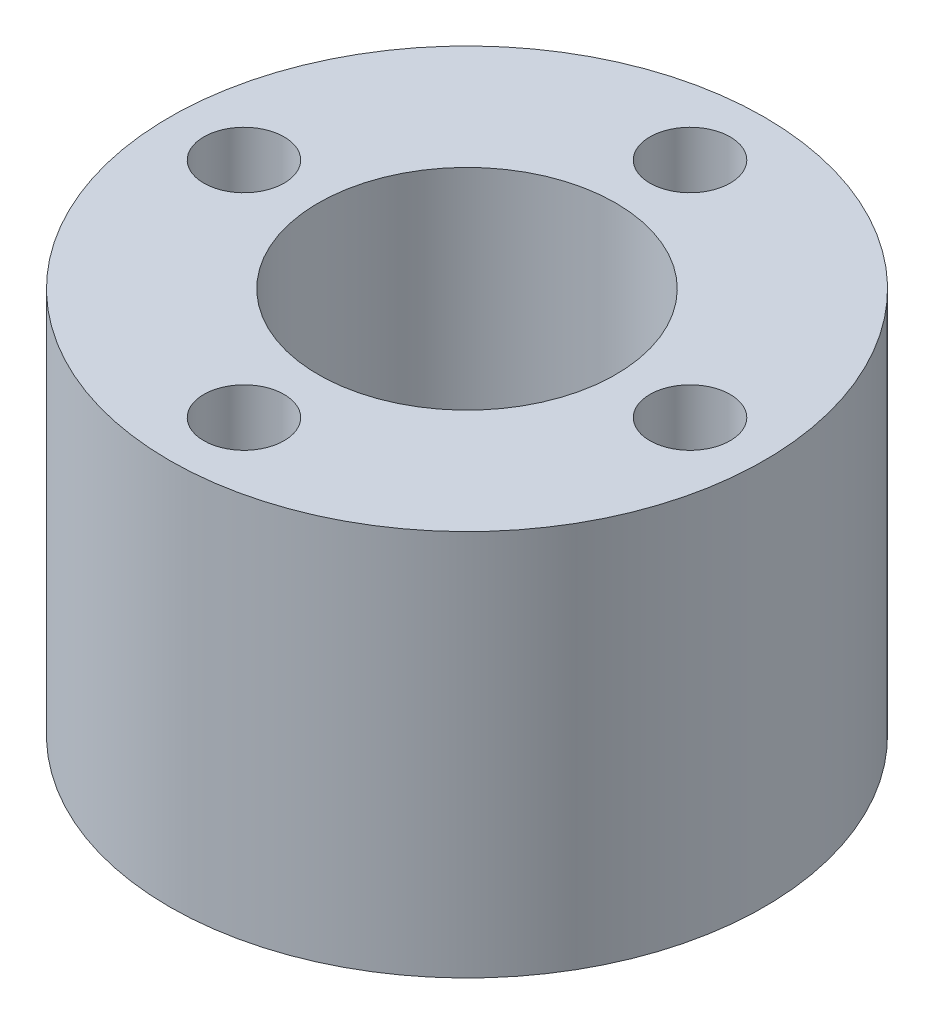
ISO-10303-21;
HEADER;
FILE_DESCRIPTION(('STEP AP214'),'2;1');
FILE_NAME('part.step','',(''),(''),'','','');
FILE_SCHEMA(('AUTOMOTIVE_DESIGN { 1 0 10303 214 1 1 1 1 }'));
ENDSEC;
DATA;
#1=APPLICATION_CONTEXT('core data for automotive mechanical design processes');
#2=APPLICATION_PROTOCOL_DEFINITION('international standard','automotive_design',2000,#1);
#3=PRODUCT_CONTEXT('',#1,'mechanical');
#4=PRODUCT('Part','Part','',(#3));
#5=PRODUCT_RELATED_PRODUCT_CATEGORY('part','',(#4));
#6=PRODUCT_DEFINITION_FORMATION('','',#4);
#7=PRODUCT_DEFINITION_CONTEXT('part definition',#1,'design');
#8=PRODUCT_DEFINITION('design','',#6,#7);
#9=PRODUCT_DEFINITION_SHAPE('','',#8);
#10=(LENGTH_UNIT() NAMED_UNIT(*) SI_UNIT(.MILLI.,.METRE.));
#11=(NAMED_UNIT(*) PLANE_ANGLE_UNIT() SI_UNIT($,.RADIAN.));
#12=(NAMED_UNIT(*) SI_UNIT($,.STERADIAN.) SOLID_ANGLE_UNIT());
#13=UNCERTAINTY_MEASURE_WITH_UNIT(LENGTH_MEASURE(1.E-05),#10,'distance_accuracy_value','');
#14=(GEOMETRIC_REPRESENTATION_CONTEXT(3) GLOBAL_UNCERTAINTY_ASSIGNED_CONTEXT((#13)) GLOBAL_UNIT_ASSIGNED_CONTEXT((#10,
#11,#12)) REPRESENTATION_CONTEXT('',''));
#15=CARTESIAN_POINT('',(0.,0.,0.));
#16=DIRECTION('',(0.,0.,1.));
#17=DIRECTION('',(1.,0.,0.));
#18=AXIS2_PLACEMENT_3D('',#15,#16,#17);
#19=CARTESIAN_POINT('',(0.,13.,0.));
#20=DIRECTION('',(0.,1.,0.));
#21=DIRECTION('',(0.,0.,1.));
#22=AXIS2_PLACEMENT_3D('',#19,#20,#21);
#23=PLANE('',#22);
#24=CARTESIAN_POINT('',(-7.5,13.,0.));
#25=DIRECTION('',(0.,1.,0.));
#26=DIRECTION('',(1.,0.,0.));
#27=AXIS2_PLACEMENT_3D('',#24,#25,#26);
#28=CIRCLE('',#27,1.35);
#29=CARTESIAN_POINT('',(-7.5,13.,1.35000000000003));
#30=VERTEX_POINT('',#29);
#31=EDGE_CURVE('E85',#30,#30,#28,.T.);
#32=ORIENTED_EDGE('',*,*,#31,.F.);
#33=EDGE_LOOP('',(#32));
#34=FACE_BOUND('',#33,.T.);
#35=CARTESIAN_POINT('',(0.,13.,7.5));
#36=DIRECTION('',(0.,1.,0.));
#37=DIRECTION('',(0.,0.,-1.));
#38=AXIS2_PLACEMENT_3D('',#35,#36,#37);
#39=CIRCLE('',#38,1.35);
#40=CARTESIAN_POINT('',(0.,13.,8.85));
#41=VERTEX_POINT('',#40);
#42=EDGE_CURVE('E79',#41,#41,#39,.T.);
#43=ORIENTED_EDGE('',*,*,#42,.F.);
#44=EDGE_LOOP('',(#43));
#45=FACE_BOUND('',#44,.T.);
#46=CARTESIAN_POINT('',(7.5,13.,0.));
#47=DIRECTION('',(0.,1.,0.));
#48=DIRECTION('',(-1.,0.,0.));
#49=AXIS2_PLACEMENT_3D('',#46,#47,#48);
#50=CIRCLE('',#49,1.35);
#51=CARTESIAN_POINT('',(7.5,13.,1.34999999999992));
#52=VERTEX_POINT('',#51);
#53=EDGE_CURVE('E72',#52,#52,#50,.T.);
#54=ORIENTED_EDGE('',*,*,#53,.F.);
#55=EDGE_LOOP('',(#54));
#56=FACE_BOUND('',#55,.T.);
#57=CARTESIAN_POINT('',(0.,13.,-7.5));
#58=DIRECTION('',(0.,1.,0.));
#59=DIRECTION('',(0.,0.,1.));
#60=AXIS2_PLACEMENT_3D('',#57,#58,#59);
#61=CIRCLE('',#60,1.35);
#62=CARTESIAN_POINT('',(0.,13.,-6.15));
#63=VERTEX_POINT('',#62);
#64=EDGE_CURVE('E60',#63,#63,#61,.T.);
#65=ORIENTED_EDGE('',*,*,#64,.F.);
#66=EDGE_LOOP('',(#65));
#67=FACE_BOUND('',#66,.T.);
#68=CARTESIAN_POINT('',(0.,13.,0.));
#69=DIRECTION('',(0.,1.,0.));
#70=DIRECTION('',(0.,0.,1.));
#71=AXIS2_PLACEMENT_3D('',#68,#69,#70);
#72=CIRCLE('',#71,10.);
#73=CARTESIAN_POINT('',(0.,13.,-10.));
#74=VERTEX_POINT('',#73);
#75=EDGE_CURVE('E10',#74,#74,#72,.T.);
#76=ORIENTED_EDGE('',*,*,#75,.T.);
#77=EDGE_LOOP('',(#76));
#78=FACE_BOUND('',#77,.T.);
#79=CARTESIAN_POINT('',(0.,13.,0.));
#80=DIRECTION('',(0.,1.,0.));
#81=DIRECTION('',(0.,0.,1.));
#82=AXIS2_PLACEMENT_3D('',#79,#80,#81);
#83=CIRCLE('',#82,5.);
#84=CARTESIAN_POINT('',(0.,13.,-5.));
#85=VERTEX_POINT('',#84);
#86=EDGE_CURVE('E52',#85,#85,#83,.T.);
#87=ORIENTED_EDGE('',*,*,#86,.F.);
#88=EDGE_LOOP('',(#87));
#89=FACE_BOUND('',#88,.T.);
#90=ADVANCED_FACE('F41',(#34,#45,#56,#67,#78,#89),#23,.T.);
#91=CARTESIAN_POINT('',(0.,0.,0.));
#92=DIRECTION('',(0.,1.,0.));
#93=DIRECTION('',(0.,0.,1.));
#94=AXIS2_PLACEMENT_3D('',#91,#92,#93);
#95=PLANE('',#94);
#96=CARTESIAN_POINT('',(7.5,0.,0.));
#97=DIRECTION('',(0.,1.,0.));
#98=DIRECTION('',(0.,0.,1.));
#99=AXIS2_PLACEMENT_3D('',#96,#97,#98);
#100=CIRCLE('',#99,1.025);
#101=CARTESIAN_POINT('',(7.5,0.,1.02499999999992));
#102=VERTEX_POINT('',#101);
#103=EDGE_CURVE('E101',#102,#102,#100,.T.);
#104=ORIENTED_EDGE('',*,*,#103,.T.);
#105=EDGE_LOOP('',(#104));
#106=FACE_BOUND('',#105,.T.);
#107=CARTESIAN_POINT('',(0.,0.,7.5));
#108=DIRECTION('',(0.,1.,0.));
#109=DIRECTION('',(0.,0.,1.));
#110=AXIS2_PLACEMENT_3D('',#107,#108,#109);
#111=CIRCLE('',#110,1.025);
#112=CARTESIAN_POINT('',(0.,0.,8.525));
#113=VERTEX_POINT('',#112);
#114=EDGE_CURVE('E95',#113,#113,#111,.T.);
#115=ORIENTED_EDGE('',*,*,#114,.T.);
#116=EDGE_LOOP('',(#115));
#117=FACE_BOUND('',#116,.T.);
#118=CARTESIAN_POINT('',(-7.5,0.,0.));
#119=DIRECTION('',(0.,1.,0.));
#120=DIRECTION('',(0.,0.,1.));
#121=AXIS2_PLACEMENT_3D('',#118,#119,#120);
#122=CIRCLE('',#121,1.025);
#123=CARTESIAN_POINT('',(-7.5,0.,1.02500000000002));
#124=VERTEX_POINT('',#123);
#125=EDGE_CURVE('E76',#124,#124,#122,.T.);
#126=ORIENTED_EDGE('',*,*,#125,.T.);
#127=EDGE_LOOP('',(#126));
#128=FACE_BOUND('',#127,.T.);
#129=CARTESIAN_POINT('',(0.,0.,-7.5));
#130=DIRECTION('',(0.,1.,0.));
#131=DIRECTION('',(0.,0.,1.));
#132=AXIS2_PLACEMENT_3D('',#129,#130,#131);
#133=CIRCLE('',#132,1.025);
#134=CARTESIAN_POINT('',(0.,0.,-6.475));
#135=VERTEX_POINT('',#134);
#136=EDGE_CURVE('E63',#135,#135,#133,.T.);
#137=ORIENTED_EDGE('',*,*,#136,.T.);
#138=EDGE_LOOP('',(#137));
#139=FACE_BOUND('',#138,.T.);
#140=CARTESIAN_POINT('',(0.,0.,0.));
#141=DIRECTION('',(0.,1.,0.));
#142=DIRECTION('',(0.,0.,1.));
#143=AXIS2_PLACEMENT_3D('',#140,#141,#142);
#144=CIRCLE('',#143,10.);
#145=CARTESIAN_POINT('',(0.,0.,-10.));
#146=VERTEX_POINT('',#145);
#147=EDGE_CURVE('E45',#146,#146,#144,.T.);
#148=ORIENTED_EDGE('',*,*,#147,.F.);
#149=EDGE_LOOP('',(#148));
#150=FACE_BOUND('',#149,.T.);
#151=CARTESIAN_POINT('',(0.,0.,0.));
#152=DIRECTION('',(0.,1.,0.));
#153=DIRECTION('',(0.,0.,1.));
#154=AXIS2_PLACEMENT_3D('',#151,#152,#153);
#155=CIRCLE('',#154,5.);
#156=CARTESIAN_POINT('',(0.,0.,-5.));
#157=VERTEX_POINT('',#156);
#158=EDGE_CURVE('E54',#157,#157,#155,.T.);
#159=ORIENTED_EDGE('',*,*,#158,.T.);
#160=EDGE_LOOP('',(#159));
#161=FACE_BOUND('',#160,.T.);
#162=ADVANCED_FACE('F127',(#106,#117,#128,#139,#150,#161),#95,.F.);
#163=CARTESIAN_POINT('',(0.,13.,0.));
#164=DIRECTION('',(0.,-1.,0.));
#165=DIRECTION('',(0.,0.,-1.));
#166=AXIS2_PLACEMENT_3D('',#163,#164,#165);
#167=CYLINDRICAL_SURFACE('',#166,10.);
#168=CARTESIAN_POINT('',(0.,13.,-10.));
#169=CARTESIAN_POINT('',(0.,12.8645833333333,-10.));
#170=CARTESIAN_POINT('',(0.,12.7291666666667,-10.));
#171=CARTESIAN_POINT('',(0.,12.4583333333333,-10.));
#172=CARTESIAN_POINT('',(0.,12.3229166666667,-10.));
#173=CARTESIAN_POINT('',(0.,12.0520833333333,-10.));
#174=CARTESIAN_POINT('',(0.,11.9166666666667,-10.));
#175=CARTESIAN_POINT('',(0.,11.6458333333333,-10.));
#176=CARTESIAN_POINT('',(0.,11.5104166666667,-10.));
#177=CARTESIAN_POINT('',(0.,11.2395833333333,-10.));
#178=CARTESIAN_POINT('',(0.,11.1041666666667,-10.));
#179=CARTESIAN_POINT('',(0.,10.8333333333333,-10.));
#180=CARTESIAN_POINT('',(0.,10.6979166666667,-10.));
#181=CARTESIAN_POINT('',(0.,10.4270833333333,-10.));
#182=CARTESIAN_POINT('',(0.,10.2916666666667,-10.));
#183=CARTESIAN_POINT('',(0.,10.0208333333333,-10.));
#184=CARTESIAN_POINT('',(0.,9.88541666666667,-10.));
#185=CARTESIAN_POINT('',(0.,9.61458333333333,-10.));
#186=CARTESIAN_POINT('',(0.,9.47916666666667,-10.));
#187=CARTESIAN_POINT('',(0.,9.20833333333333,-10.));
#188=CARTESIAN_POINT('',(0.,9.07291666666666,-10.));
#189=CARTESIAN_POINT('',(0.,8.80208333333333,-10.));
#190=CARTESIAN_POINT('',(0.,8.66666666666667,-10.));
#191=CARTESIAN_POINT('',(0.,8.39583333333333,-10.));
#192=CARTESIAN_POINT('',(0.,8.26041666666667,-10.));
#193=CARTESIAN_POINT('',(0.,7.98958333333333,-10.));
#194=CARTESIAN_POINT('',(0.,7.85416666666667,-10.));
#195=CARTESIAN_POINT('',(0.,7.58333333333333,-10.));
#196=CARTESIAN_POINT('',(0.,7.44791666666667,-10.));
#197=CARTESIAN_POINT('',(0.,7.17708333333333,-10.));
#198=CARTESIAN_POINT('',(0.,7.04166666666667,-10.));
#199=CARTESIAN_POINT('',(0.,6.77083333333333,-10.));
#200=CARTESIAN_POINT('',(0.,6.63541666666667,-10.));
#201=CARTESIAN_POINT('',(0.,6.36458333333333,-10.));
#202=CARTESIAN_POINT('',(0.,6.22916666666667,-10.));
#203=CARTESIAN_POINT('',(0.,5.95833333333333,-10.));
#204=CARTESIAN_POINT('',(0.,5.82291666666667,-10.));
#205=CARTESIAN_POINT('',(0.,5.55208333333333,-10.));
#206=CARTESIAN_POINT('',(0.,5.41666666666667,-10.));
#207=CARTESIAN_POINT('',(0.,5.14583333333333,-10.));
#208=CARTESIAN_POINT('',(0.,5.01041666666667,-10.));
#209=CARTESIAN_POINT('',(0.,4.73958333333333,-10.));
#210=CARTESIAN_POINT('',(0.,4.60416666666667,-10.));
#211=CARTESIAN_POINT('',(0.,4.33333333333333,-10.));
#212=CARTESIAN_POINT('',(0.,4.19791666666667,-10.));
#213=CARTESIAN_POINT('',(0.,3.92708333333333,-10.));
#214=CARTESIAN_POINT('',(0.,3.79166666666667,-10.));
#215=CARTESIAN_POINT('',(0.,3.52083333333333,-10.));
#216=CARTESIAN_POINT('',(0.,3.38541666666667,-10.));
#217=CARTESIAN_POINT('',(0.,3.11458333333333,-10.));
#218=CARTESIAN_POINT('',(0.,2.97916666666667,-10.));
#219=CARTESIAN_POINT('',(0.,2.70833333333333,-10.));
#220=CARTESIAN_POINT('',(0.,2.57291666666667,-10.));
#221=CARTESIAN_POINT('',(0.,2.30208333333333,-10.));
#222=CARTESIAN_POINT('',(0.,2.16666666666667,-10.));
#223=CARTESIAN_POINT('',(0.,1.89583333333333,-10.));
#224=CARTESIAN_POINT('',(0.,1.76041666666667,-10.));
#225=CARTESIAN_POINT('',(0.,1.48958333333333,-10.));
#226=CARTESIAN_POINT('',(0.,1.35416666666667,-10.));
#227=CARTESIAN_POINT('',(0.,1.08333333333333,-10.));
#228=CARTESIAN_POINT('',(0.,0.947916666666667,-10.));
#229=CARTESIAN_POINT('',(0.,0.677083333333334,-10.));
#230=CARTESIAN_POINT('',(0.,0.541666666666667,-10.));
#231=CARTESIAN_POINT('',(0.,0.270833333333334,-10.));
#232=CARTESIAN_POINT('',(0.,0.135416666666667,-10.));
#233=CARTESIAN_POINT('',(0.,0.,-10.));
#234=B_SPLINE_CURVE_WITH_KNOTS('',3,(#168,#169,#170,#171,#172,#173,#174,#175,#176,#177,#178,
#179,#180,#181,#182,#183,#184,#185,#186,#187,#188,#189,#190,#191,#192,#193,#194,#195,#196,#197,
#198,#199,#200,#201,#202,#203,#204,#205,#206,#207,#208,#209,#210,#211,#212,#213,#214,#215,#216,
#217,#218,#219,#220,#221,#222,#223,#224,#225,#226,#227,#228,#229,#230,#231,#232,#233),
.UNSPECIFIED.,.F.,.F.,(4,2,2,2,2,2,2,2,2,2,2,2,2,2,2,2,2,2,2,2,2,2,2,2,2,2,2,2,2,2,2,2,4),(0.,
0.40625,0.812500000000001,1.21875,1.625,2.03125,2.4375,2.84375,3.25,3.65625,4.0625,4.46875,
4.875,5.28125,5.6875,6.09375,6.5,6.90625,7.3125,7.71875,8.125,8.53125,8.9375,9.34375,9.75,
10.15625,10.5625,10.96875,11.375,11.78125,12.1875,12.59375,13.),.UNSPECIFIED.);
#235=EDGE_CURVE('BSEAM43',#74,#146,#234,.T.);
#236=ORIENTED_EDGE('',*,*,#75,.F.);
#237=ORIENTED_EDGE('',*,*,#147,.T.);
#238=ORIENTED_EDGE('',*,*,#235,.T.);
#239=ORIENTED_EDGE('',*,*,#235,.F.);
#240=EDGE_LOOP('',(#236,#238,#237,#239));
#241=FACE_BOUND('',#240,.T.);
#242=ADVANCED_FACE('F43',(#241),#167,.T.);
#243=CARTESIAN_POINT('',(0.,13.,0.));
#244=DIRECTION('',(0.,-1.,0.));
#245=DIRECTION('',(0.,0.,-1.));
#246=AXIS2_PLACEMENT_3D('',#243,#244,#245);
#247=CYLINDRICAL_SURFACE('',#246,5.);
#248=CARTESIAN_POINT('',(0.,13.,-5.));
#249=CARTESIAN_POINT('',(0.,12.8645833333333,-5.));
#250=CARTESIAN_POINT('',(0.,12.7291666666667,-5.));
#251=CARTESIAN_POINT('',(0.,12.4583333333333,-5.));
#252=CARTESIAN_POINT('',(0.,12.3229166666667,-5.));
#253=CARTESIAN_POINT('',(0.,12.0520833333333,-5.));
#254=CARTESIAN_POINT('',(0.,11.9166666666667,-5.));
#255=CARTESIAN_POINT('',(0.,11.6458333333333,-5.));
#256=CARTESIAN_POINT('',(0.,11.5104166666667,-5.));
#257=CARTESIAN_POINT('',(0.,11.2395833333333,-5.));
#258=CARTESIAN_POINT('',(0.,11.1041666666667,-5.));
#259=CARTESIAN_POINT('',(0.,10.8333333333333,-5.));
#260=CARTESIAN_POINT('',(0.,10.6979166666667,-5.));
#261=CARTESIAN_POINT('',(0.,10.4270833333333,-5.));
#262=CARTESIAN_POINT('',(0.,10.2916666666667,-5.));
#263=CARTESIAN_POINT('',(0.,10.0208333333333,-5.));
#264=CARTESIAN_POINT('',(0.,9.88541666666667,-5.));
#265=CARTESIAN_POINT('',(0.,9.61458333333333,-5.));
#266=CARTESIAN_POINT('',(0.,9.47916666666667,-5.));
#267=CARTESIAN_POINT('',(0.,9.20833333333333,-5.));
#268=CARTESIAN_POINT('',(0.,9.07291666666667,-5.));
#269=CARTESIAN_POINT('',(0.,8.80208333333333,-5.));
#270=CARTESIAN_POINT('',(0.,8.66666666666667,-5.));
#271=CARTESIAN_POINT('',(0.,8.39583333333333,-5.));
#272=CARTESIAN_POINT('',(0.,8.26041666666667,-5.));
#273=CARTESIAN_POINT('',(0.,7.98958333333333,-5.));
#274=CARTESIAN_POINT('',(0.,7.85416666666667,-5.));
#275=CARTESIAN_POINT('',(0.,7.58333333333333,-5.));
#276=CARTESIAN_POINT('',(0.,7.44791666666667,-5.));
#277=CARTESIAN_POINT('',(0.,7.17708333333333,-5.));
#278=CARTESIAN_POINT('',(0.,7.04166666666667,-5.));
#279=CARTESIAN_POINT('',(0.,6.77083333333333,-5.));
#280=CARTESIAN_POINT('',(0.,6.63541666666667,-5.));
#281=CARTESIAN_POINT('',(0.,6.36458333333333,-5.));
#282=CARTESIAN_POINT('',(0.,6.22916666666667,-5.));
#283=CARTESIAN_POINT('',(0.,5.95833333333333,-5.));
#284=CARTESIAN_POINT('',(0.,5.82291666666667,-5.));
#285=CARTESIAN_POINT('',(0.,5.55208333333333,-5.));
#286=CARTESIAN_POINT('',(0.,5.41666666666667,-5.));
#287=CARTESIAN_POINT('',(0.,5.14583333333333,-5.));
#288=CARTESIAN_POINT('',(0.,5.01041666666667,-5.));
#289=CARTESIAN_POINT('',(0.,4.73958333333333,-5.));
#290=CARTESIAN_POINT('',(0.,4.60416666666667,-5.));
#291=CARTESIAN_POINT('',(0.,4.33333333333333,-5.));
#292=CARTESIAN_POINT('',(0.,4.19791666666667,-5.));
#293=CARTESIAN_POINT('',(0.,3.92708333333333,-5.));
#294=CARTESIAN_POINT('',(0.,3.79166666666667,-5.));
#295=CARTESIAN_POINT('',(0.,3.52083333333333,-5.));
#296=CARTESIAN_POINT('',(0.,3.38541666666667,-5.));
#297=CARTESIAN_POINT('',(0.,3.11458333333333,-5.));
#298=CARTESIAN_POINT('',(0.,2.97916666666667,-5.));
#299=CARTESIAN_POINT('',(0.,2.70833333333333,-5.));
#300=CARTESIAN_POINT('',(0.,2.57291666666667,-5.));
#301=CARTESIAN_POINT('',(0.,2.30208333333333,-5.));
#302=CARTESIAN_POINT('',(0.,2.16666666666667,-5.));
#303=CARTESIAN_POINT('',(0.,1.89583333333333,-5.));
#304=CARTESIAN_POINT('',(0.,1.76041666666667,-5.));
#305=CARTESIAN_POINT('',(0.,1.48958333333333,-5.));
#306=CARTESIAN_POINT('',(0.,1.35416666666667,-5.));
#307=CARTESIAN_POINT('',(0.,1.08333333333333,-5.));
#308=CARTESIAN_POINT('',(0.,0.947916666666667,-5.));
#309=CARTESIAN_POINT('',(0.,0.677083333333334,-5.));
#310=CARTESIAN_POINT('',(0.,0.541666666666667,-5.));
#311=CARTESIAN_POINT('',(0.,0.270833333333334,-5.));
#312=CARTESIAN_POINT('',(0.,0.135416666666667,-5.));
#313=CARTESIAN_POINT('',(0.,0.,-5.));
#314=B_SPLINE_CURVE_WITH_KNOTS('',3,(#248,#249,#250,#251,#252,#253,#254,#255,#256,#257,#258,
#259,#260,#261,#262,#263,#264,#265,#266,#267,#268,#269,#270,#271,#272,#273,#274,#275,#276,#277,
#278,#279,#280,#281,#282,#283,#284,#285,#286,#287,#288,#289,#290,#291,#292,#293,#294,#295,#296,
#297,#298,#299,#300,#301,#302,#303,#304,#305,#306,#307,#308,#309,#310,#311,#312,#313),
.UNSPECIFIED.,.F.,.F.,(4,2,2,2,2,2,2,2,2,2,2,2,2,2,2,2,2,2,2,2,2,2,2,2,2,2,2,2,2,2,2,2,4),(0.,
0.406249999999999,0.812499999999999,1.21875,1.625,2.03125,2.4375,2.84375,3.25,3.65625,4.0625,
4.46875,4.875,5.28125,5.6875,6.09375,6.5,6.90625,7.3125,7.71875,8.125,8.53125,8.9375,9.34375,
9.75,10.15625,10.5625,10.96875,11.375,11.78125,12.1875,12.59375,13.),.UNSPECIFIED.);
#315=EDGE_CURVE('BSEAM134',#85,#157,#314,.T.);
#316=ORIENTED_EDGE('',*,*,#86,.T.);
#317=ORIENTED_EDGE('',*,*,#158,.F.);
#318=ORIENTED_EDGE('',*,*,#315,.T.);
#319=ORIENTED_EDGE('',*,*,#315,.F.);
#320=EDGE_LOOP('',(#316,#318,#317,#319));
#321=FACE_BOUND('',#320,.T.);
#322=ADVANCED_FACE('F134',(#321),#247,.F.);
#323=CARTESIAN_POINT('',(0.,6.5,-7.5));
#324=DIRECTION('',(0.,1.,0.));
#325=DIRECTION('',(0.,0.,1.));
#326=AXIS2_PLACEMENT_3D('',#323,#324,#325);
#327=CYLINDRICAL_SURFACE('',#326,1.35);
#328=CARTESIAN_POINT('',(0.,6.5,-7.5));
#329=DIRECTION('',(0.,1.,0.));
#330=DIRECTION('',(0.,0.,1.));
#331=AXIS2_PLACEMENT_3D('',#328,#329,#330);
#332=CIRCLE('',#331,1.35);
#333=CARTESIAN_POINT('',(0.,6.5,-6.15));
#334=VERTEX_POINT('',#333);
#335=EDGE_CURVE('E57',#334,#334,#332,.T.);
#336=CARTESIAN_POINT('',(0.,6.5,-6.15));
#337=CARTESIAN_POINT('',(0.,6.56770833333333,-6.15));
#338=CARTESIAN_POINT('',(0.,6.63541666666667,-6.15));
#339=CARTESIAN_POINT('',(0.,6.77083333333333,-6.15));
#340=CARTESIAN_POINT('',(0.,6.83854166666667,-6.15));
#341=CARTESIAN_POINT('',(0.,6.97395833333333,-6.15));
#342=CARTESIAN_POINT('',(0.,7.04166666666667,-6.15));
#343=CARTESIAN_POINT('',(0.,7.17708333333333,-6.15));
#344=CARTESIAN_POINT('',(0.,7.24479166666667,-6.15));
#345=CARTESIAN_POINT('',(0.,7.38020833333333,-6.15));
#346=CARTESIAN_POINT('',(0.,7.44791666666667,-6.15));
#347=CARTESIAN_POINT('',(0.,7.58333333333333,-6.15));
#348=CARTESIAN_POINT('',(0.,7.65104166666667,-6.15));
#349=CARTESIAN_POINT('',(0.,7.78645833333333,-6.15));
#350=CARTESIAN_POINT('',(0.,7.85416666666667,-6.15));
#351=CARTESIAN_POINT('',(0.,7.98958333333333,-6.15));
#352=CARTESIAN_POINT('',(0.,8.05729166666667,-6.15));
#353=CARTESIAN_POINT('',(0.,8.19270833333333,-6.15));
#354=CARTESIAN_POINT('',(0.,8.26041666666667,-6.15));
#355=CARTESIAN_POINT('',(0.,8.39583333333333,-6.15));
#356=CARTESIAN_POINT('',(0.,8.46354166666667,-6.15));
#357=CARTESIAN_POINT('',(0.,8.59895833333333,-6.15));
#358=CARTESIAN_POINT('',(0.,8.66666666666667,-6.15));
#359=CARTESIAN_POINT('',(0.,8.80208333333333,-6.15));
#360=CARTESIAN_POINT('',(0.,8.86979166666667,-6.15));
#361=CARTESIAN_POINT('',(0.,9.00520833333333,-6.15));
#362=CARTESIAN_POINT('',(0.,9.07291666666667,-6.15));
#363=CARTESIAN_POINT('',(0.,9.20833333333333,-6.15));
#364=CARTESIAN_POINT('',(0.,9.27604166666667,-6.15));
#365=CARTESIAN_POINT('',(0.,9.41145833333333,-6.15));
#366=CARTESIAN_POINT('',(0.,9.47916666666667,-6.15));
#367=CARTESIAN_POINT('',(0.,9.61458333333333,-6.15));
#368=CARTESIAN_POINT('',(0.,9.68229166666667,-6.15));
#369=CARTESIAN_POINT('',(0.,9.81770833333333,-6.15));
#370=CARTESIAN_POINT('',(0.,9.88541666666667,-6.15));
#371=CARTESIAN_POINT('',(0.,10.0208333333333,-6.15));
#372=CARTESIAN_POINT('',(0.,10.0885416666667,-6.15));
#373=CARTESIAN_POINT('',(0.,10.2239583333333,-6.15));
#374=CARTESIAN_POINT('',(0.,10.2916666666667,-6.15));
#375=CARTESIAN_POINT('',(0.,10.4270833333333,-6.15));
#376=CARTESIAN_POINT('',(0.,10.4947916666667,-6.15));
#377=CARTESIAN_POINT('',(0.,10.6302083333333,-6.15));
#378=CARTESIAN_POINT('',(0.,10.6979166666667,-6.15));
#379=CARTESIAN_POINT('',(0.,10.8333333333333,-6.15));
#380=CARTESIAN_POINT('',(0.,10.9010416666667,-6.15));
#381=CARTESIAN_POINT('',(0.,11.0364583333333,-6.15));
#382=CARTESIAN_POINT('',(0.,11.1041666666667,-6.15));
#383=CARTESIAN_POINT('',(0.,11.2395833333333,-6.15));
#384=CARTESIAN_POINT('',(0.,11.3072916666667,-6.15));
#385=CARTESIAN_POINT('',(0.,11.4427083333333,-6.15));
#386=CARTESIAN_POINT('',(0.,11.5104166666667,-6.15));
#387=CARTESIAN_POINT('',(0.,11.6458333333333,-6.15));
#388=CARTESIAN_POINT('',(0.,11.7135416666667,-6.15));
#389=CARTESIAN_POINT('',(0.,11.8489583333333,-6.15));
#390=CARTESIAN_POINT('',(0.,11.9166666666667,-6.15));
#391=CARTESIAN_POINT('',(0.,12.0520833333333,-6.15));
#392=CARTESIAN_POINT('',(0.,12.1197916666667,-6.15));
#393=CARTESIAN_POINT('',(0.,12.2552083333333,-6.15));
#394=CARTESIAN_POINT('',(0.,12.3229166666667,-6.15));
#395=CARTESIAN_POINT('',(0.,12.4583333333333,-6.15));
#396=CARTESIAN_POINT('',(0.,12.5260416666667,-6.15));
#397=CARTESIAN_POINT('',(0.,12.6614583333333,-6.15));
#398=CARTESIAN_POINT('',(0.,12.7291666666667,-6.15));
#399=CARTESIAN_POINT('',(0.,12.8645833333333,-6.15));
#400=CARTESIAN_POINT('',(0.,12.9322916666667,-6.15));
#401=CARTESIAN_POINT('',(0.,13.,-6.15));
#402=B_SPLINE_CURVE_WITH_KNOTS('',3,(#336,#337,#338,#339,#340,#341,#342,#343,#344,#345,#346,
#347,#348,#349,#350,#351,#352,#353,#354,#355,#356,#357,#358,#359,#360,#361,#362,#363,#364,#365,
#366,#367,#368,#369,#370,#371,#372,#373,#374,#375,#376,#377,#378,#379,#380,#381,#382,#383,#384,
#385,#386,#387,#388,#389,#390,#391,#392,#393,#394,#395,#396,#397,#398,#399,#400,#401),
.UNSPECIFIED.,.F.,.F.,(4,2,2,2,2,2,2,2,2,2,2,2,2,2,2,2,2,2,2,2,2,2,2,2,2,2,2,2,2,2,2,2,4),(0.,
0.203125,0.40625,0.609375000000001,0.812500000000001,1.015625,1.21875,1.421875,1.625,1.828125,
2.03125,2.234375,2.4375,2.640625,2.84375,3.046875,3.25,3.453125,3.65625,3.859375,4.0625,
4.265625,4.46875,4.671875,4.875,5.078125,5.28125,5.484375,5.6875,5.890625,6.09375,6.296875,6.5),.UNSPECIFIED.);
#403=EDGE_CURVE('BSEAM137',#334,#63,#402,.T.);
#404=ORIENTED_EDGE('',*,*,#335,.F.);
#405=ORIENTED_EDGE('',*,*,#64,.T.);
#406=ORIENTED_EDGE('',*,*,#403,.T.);
#407=ORIENTED_EDGE('',*,*,#403,.F.);
#408=EDGE_LOOP('',(#404,#406,#405,#407));
#409=FACE_BOUND('',#408,.T.);
#410=ADVANCED_FACE('F137',(#409),#327,.F.);
#411=CARTESIAN_POINT('',(0.,6.5,-7.5));
#412=DIRECTION('',(0.,1.,0.));
#413=DIRECTION('',(0.,0.,1.));
#414=AXIS2_PLACEMENT_3D('',#411,#412,#413);
#415=PLANE('',#414);
#416=CARTESIAN_POINT('',(0.,6.5,-7.5));
#417=DIRECTION('',(0.,1.,0.));
#418=DIRECTION('',(0.,0.,1.));
#419=AXIS2_PLACEMENT_3D('',#416,#417,#418);
#420=CIRCLE('',#419,1.025);
#421=CARTESIAN_POINT('',(0.,6.5,-6.475));
#422=VERTEX_POINT('',#421);
#423=EDGE_CURVE('E68',#422,#422,#420,.T.);
#424=ORIENTED_EDGE('',*,*,#423,.F.);
#425=EDGE_LOOP('',(#424));
#426=FACE_BOUND('',#425,.T.);
#427=ORIENTED_EDGE('',*,*,#335,.T.);
#428=EDGE_LOOP('',(#427));
#429=FACE_BOUND('',#428,.T.);
#430=ADVANCED_FACE('F151',(#426,#429),#415,.T.);
#431=CARTESIAN_POINT('',(0.,6.5,-7.5));
#432=DIRECTION('',(0.,1.,0.));
#433=DIRECTION('',(0.,0.,1.));
#434=AXIS2_PLACEMENT_3D('',#431,#432,#433);
#435=CYLINDRICAL_SURFACE('',#434,1.025);
#436=ORIENTED_EDGE('',*,*,#423,.T.);
#437=EDGE_LOOP('',(#436));
#438=FACE_BOUND('',#437,.T.);
#439=ORIENTED_EDGE('',*,*,#136,.F.);
#440=EDGE_LOOP('',(#439));
#441=FACE_BOUND('',#440,.T.);
#442=ADVANCED_FACE('F121',(#438,#441),#435,.F.);
#443=CARTESIAN_POINT('',(7.5,6.5,0.));
#444=DIRECTION('',(0.,1.,0.));
#445=DIRECTION('',(0.,0.,1.));
#446=AXIS2_PLACEMENT_3D('',#443,#444,#445);
#447=CYLINDRICAL_SURFACE('',#446,1.35);
#448=CARTESIAN_POINT('',(7.5,6.5,0.));
#449=DIRECTION('',(0.,1.,0.));
#450=DIRECTION('',(-1.,0.,0.));
#451=AXIS2_PLACEMENT_3D('',#448,#449,#450);
#452=CIRCLE('',#451,1.35);
#453=CARTESIAN_POINT('',(7.5,6.5,1.34999999999992));
#454=VERTEX_POINT('',#453);
#455=EDGE_CURVE('E75',#454,#454,#452,.T.);
#456=CARTESIAN_POINT('',(7.5,6.5,1.34999999999992));
#457=CARTESIAN_POINT('',(7.5,6.56770833333333,1.34999999999992));
#458=CARTESIAN_POINT('',(7.5,6.63541666666667,1.34999999999992));
#459=CARTESIAN_POINT('',(7.5,6.77083333333333,1.34999999999992));
#460=CARTESIAN_POINT('',(7.5,6.83854166666667,1.34999999999992));
#461=CARTESIAN_POINT('',(7.5,6.97395833333333,1.34999999999992));
#462=CARTESIAN_POINT('',(7.5,7.04166666666667,1.34999999999992));
#463=CARTESIAN_POINT('',(7.5,7.17708333333333,1.34999999999992));
#464=CARTESIAN_POINT('',(7.5,7.24479166666667,1.34999999999992));
#465=CARTESIAN_POINT('',(7.5,7.38020833333333,1.34999999999992));
#466=CARTESIAN_POINT('',(7.5,7.44791666666667,1.34999999999992));
#467=CARTESIAN_POINT('',(7.5,7.58333333333333,1.34999999999992));
#468=CARTESIAN_POINT('',(7.5,7.65104166666667,1.34999999999992));
#469=CARTESIAN_POINT('',(7.5,7.78645833333333,1.34999999999992));
#470=CARTESIAN_POINT('',(7.5,7.85416666666667,1.34999999999992));
#471=CARTESIAN_POINT('',(7.5,7.98958333333333,1.34999999999992));
#472=CARTESIAN_POINT('',(7.5,8.05729166666667,1.34999999999992));
#473=CARTESIAN_POINT('',(7.5,8.19270833333333,1.34999999999992));
#474=CARTESIAN_POINT('',(7.5,8.26041666666667,1.34999999999992));
#475=CARTESIAN_POINT('',(7.5,8.39583333333333,1.34999999999992));
#476=CARTESIAN_POINT('',(7.5,8.46354166666667,1.34999999999992));
#477=CARTESIAN_POINT('',(7.5,8.59895833333333,1.34999999999992));
#478=CARTESIAN_POINT('',(7.5,8.66666666666667,1.34999999999992));
#479=CARTESIAN_POINT('',(7.5,8.80208333333333,1.34999999999992));
#480=CARTESIAN_POINT('',(7.5,8.86979166666667,1.34999999999992));
#481=CARTESIAN_POINT('',(7.5,9.00520833333333,1.34999999999992));
#482=CARTESIAN_POINT('',(7.5,9.07291666666667,1.34999999999992));
#483=CARTESIAN_POINT('',(7.5,9.20833333333333,1.34999999999992));
#484=CARTESIAN_POINT('',(7.5,9.27604166666667,1.34999999999992));
#485=CARTESIAN_POINT('',(7.5,9.41145833333333,1.34999999999992));
#486=CARTESIAN_POINT('',(7.5,9.47916666666667,1.34999999999992));
#487=CARTESIAN_POINT('',(7.5,9.61458333333333,1.34999999999992));
#488=CARTESIAN_POINT('',(7.5,9.68229166666667,1.34999999999992));
#489=CARTESIAN_POINT('',(7.5,9.81770833333333,1.34999999999992));
#490=CARTESIAN_POINT('',(7.5,9.88541666666667,1.34999999999992));
#491=CARTESIAN_POINT('',(7.5,10.0208333333333,1.34999999999992));
#492=CARTESIAN_POINT('',(7.5,10.0885416666667,1.34999999999992));
#493=CARTESIAN_POINT('',(7.5,10.2239583333333,1.34999999999992));
#494=CARTESIAN_POINT('',(7.5,10.2916666666667,1.34999999999992));
#495=CARTESIAN_POINT('',(7.5,10.4270833333333,1.34999999999992));
#496=CARTESIAN_POINT('',(7.5,10.4947916666667,1.34999999999992));
#497=CARTESIAN_POINT('',(7.5,10.6302083333333,1.34999999999992));
#498=CARTESIAN_POINT('',(7.5,10.6979166666667,1.34999999999992));
#499=CARTESIAN_POINT('',(7.5,10.8333333333333,1.34999999999992));
#500=CARTESIAN_POINT('',(7.5,10.9010416666667,1.34999999999992));
#501=CARTESIAN_POINT('',(7.5,11.0364583333333,1.34999999999992));
#502=CARTESIAN_POINT('',(7.5,11.1041666666667,1.34999999999992));
#503=CARTESIAN_POINT('',(7.5,11.2395833333333,1.34999999999992));
#504=CARTESIAN_POINT('',(7.5,11.3072916666667,1.34999999999992));
#505=CARTESIAN_POINT('',(7.5,11.4427083333333,1.34999999999992));
#506=CARTESIAN_POINT('',(7.5,11.5104166666667,1.34999999999992));
#507=CARTESIAN_POINT('',(7.5,11.6458333333333,1.34999999999992));
#508=CARTESIAN_POINT('',(7.5,11.7135416666667,1.34999999999992));
#509=CARTESIAN_POINT('',(7.5,11.8489583333333,1.34999999999992));
#510=CARTESIAN_POINT('',(7.5,11.9166666666667,1.34999999999992));
#511=CARTESIAN_POINT('',(7.5,12.0520833333333,1.34999999999992));
#512=CARTESIAN_POINT('',(7.5,12.1197916666667,1.34999999999992));
#513=CARTESIAN_POINT('',(7.5,12.2552083333333,1.34999999999992));
#514=CARTESIAN_POINT('',(7.5,12.3229166666667,1.34999999999992));
#515=CARTESIAN_POINT('',(7.5,12.4583333333333,1.34999999999992));
#516=CARTESIAN_POINT('',(7.5,12.5260416666667,1.34999999999992));
#517=CARTESIAN_POINT('',(7.5,12.6614583333333,1.34999999999992));
#518=CARTESIAN_POINT('',(7.5,12.7291666666667,1.34999999999992));
#519=CARTESIAN_POINT('',(7.5,12.8645833333333,1.34999999999992));
#520=CARTESIAN_POINT('',(7.5,12.9322916666667,1.34999999999992));
#521=CARTESIAN_POINT('',(7.5,13.,1.34999999999992));
#522=B_SPLINE_CURVE_WITH_KNOTS('',3,(#456,#457,#458,#459,#460,#461,#462,#463,#464,#465,#466,
#467,#468,#469,#470,#471,#472,#473,#474,#475,#476,#477,#478,#479,#480,#481,#482,#483,#484,#485,
#486,#487,#488,#489,#490,#491,#492,#493,#494,#495,#496,#497,#498,#499,#500,#501,#502,#503,#504,
#505,#506,#507,#508,#509,#510,#511,#512,#513,#514,#515,#516,#517,#518,#519,#520,#521),
.UNSPECIFIED.,.F.,.F.,(4,2,2,2,2,2,2,2,2,2,2,2,2,2,2,2,2,2,2,2,2,2,2,2,2,2,2,2,2,2,2,2,4),(0.,
0.203125,0.40625,0.609375000000001,0.812500000000001,1.015625,1.21875,1.421875,1.625,1.828125,
2.03125,2.234375,2.4375,2.640625,2.84375,3.046875,3.25,3.453125,3.65625,3.859375,4.0625,
4.265625,4.46875,4.671875,4.875,5.078125,5.28125,5.484375,5.6875,5.890625,6.09375,6.296875,6.5),.UNSPECIFIED.);
#523=EDGE_CURVE('BSEAM115',#454,#52,#522,.T.);
#524=ORIENTED_EDGE('',*,*,#455,.F.);
#525=ORIENTED_EDGE('',*,*,#53,.T.);
#526=ORIENTED_EDGE('',*,*,#523,.T.);
#527=ORIENTED_EDGE('',*,*,#523,.F.);
#528=EDGE_LOOP('',(#524,#526,#525,#527));
#529=FACE_BOUND('',#528,.T.);
#530=ADVANCED_FACE('F115',(#529),#447,.F.);
#531=CARTESIAN_POINT('',(7.5,6.5,0.));
#532=DIRECTION('',(0.,1.,0.));
#533=DIRECTION('',(-1.,0.,0.));
#534=AXIS2_PLACEMENT_3D('',#531,#532,#533);
#535=PLANE('',#534);
#536=CARTESIAN_POINT('',(7.5,6.5,0.));
#537=DIRECTION('',(0.,1.,0.));
#538=DIRECTION('',(0.,0.,1.));
#539=AXIS2_PLACEMENT_3D('',#536,#537,#538);
#540=CIRCLE('',#539,1.025);
#541=CARTESIAN_POINT('',(7.5,6.5,1.02499999999992));
#542=VERTEX_POINT('',#541);
#543=EDGE_CURVE('E104',#542,#542,#540,.T.);
#544=ORIENTED_EDGE('',*,*,#543,.F.);
#545=EDGE_LOOP('',(#544));
#546=FACE_BOUND('',#545,.T.);
#547=ORIENTED_EDGE('',*,*,#455,.T.);
#548=EDGE_LOOP('',(#547));
#549=FACE_BOUND('',#548,.T.);
#550=ADVANCED_FACE('F111',(#546,#549),#535,.T.);
#551=CARTESIAN_POINT('',(0.,6.5,7.5));
#552=DIRECTION('',(0.,1.,0.));
#553=DIRECTION('',(0.,0.,1.));
#554=AXIS2_PLACEMENT_3D('',#551,#552,#553);
#555=CYLINDRICAL_SURFACE('',#554,1.35);
#556=CARTESIAN_POINT('',(0.,6.5,7.5));
#557=DIRECTION('',(0.,1.,0.));
#558=DIRECTION('',(0.,0.,-1.));
#559=AXIS2_PLACEMENT_3D('',#556,#557,#558);
#560=CIRCLE('',#559,1.35);
#561=CARTESIAN_POINT('',(0.,6.5,8.85));
#562=VERTEX_POINT('',#561);
#563=EDGE_CURVE('E82',#562,#562,#560,.T.);
#564=CARTESIAN_POINT('',(0.,6.5,8.85));
#565=CARTESIAN_POINT('',(0.,6.56770833333333,8.85));
#566=CARTESIAN_POINT('',(0.,6.63541666666667,8.85));
#567=CARTESIAN_POINT('',(0.,6.77083333333333,8.85));
#568=CARTESIAN_POINT('',(0.,6.83854166666667,8.85));
#569=CARTESIAN_POINT('',(0.,6.97395833333333,8.85));
#570=CARTESIAN_POINT('',(0.,7.04166666666667,8.85));
#571=CARTESIAN_POINT('',(0.,7.17708333333333,8.85));
#572=CARTESIAN_POINT('',(0.,7.24479166666667,8.85));
#573=CARTESIAN_POINT('',(0.,7.38020833333333,8.85));
#574=CARTESIAN_POINT('',(0.,7.44791666666667,8.85));
#575=CARTESIAN_POINT('',(0.,7.58333333333333,8.85));
#576=CARTESIAN_POINT('',(0.,7.65104166666667,8.85));
#577=CARTESIAN_POINT('',(0.,7.78645833333333,8.85));
#578=CARTESIAN_POINT('',(0.,7.85416666666667,8.85));
#579=CARTESIAN_POINT('',(0.,7.98958333333333,8.85));
#580=CARTESIAN_POINT('',(0.,8.05729166666667,8.85));
#581=CARTESIAN_POINT('',(0.,8.19270833333333,8.85));
#582=CARTESIAN_POINT('',(0.,8.26041666666667,8.85));
#583=CARTESIAN_POINT('',(0.,8.39583333333333,8.85));
#584=CARTESIAN_POINT('',(0.,8.46354166666667,8.85));
#585=CARTESIAN_POINT('',(0.,8.59895833333333,8.85));
#586=CARTESIAN_POINT('',(0.,8.66666666666667,8.85));
#587=CARTESIAN_POINT('',(0.,8.80208333333333,8.85));
#588=CARTESIAN_POINT('',(0.,8.86979166666667,8.85));
#589=CARTESIAN_POINT('',(0.,9.00520833333333,8.85));
#590=CARTESIAN_POINT('',(0.,9.07291666666667,8.85));
#591=CARTESIAN_POINT('',(0.,9.20833333333333,8.85));
#592=CARTESIAN_POINT('',(0.,9.27604166666667,8.85));
#593=CARTESIAN_POINT('',(0.,9.41145833333333,8.85));
#594=CARTESIAN_POINT('',(0.,9.47916666666667,8.85));
#595=CARTESIAN_POINT('',(0.,9.61458333333333,8.85));
#596=CARTESIAN_POINT('',(0.,9.68229166666667,8.85));
#597=CARTESIAN_POINT('',(0.,9.81770833333333,8.85));
#598=CARTESIAN_POINT('',(0.,9.88541666666667,8.85));
#599=CARTESIAN_POINT('',(0.,10.0208333333333,8.85));
#600=CARTESIAN_POINT('',(0.,10.0885416666667,8.85));
#601=CARTESIAN_POINT('',(0.,10.2239583333333,8.85));
#602=CARTESIAN_POINT('',(0.,10.2916666666667,8.85));
#603=CARTESIAN_POINT('',(0.,10.4270833333333,8.85));
#604=CARTESIAN_POINT('',(0.,10.4947916666667,8.85));
#605=CARTESIAN_POINT('',(0.,10.6302083333333,8.85));
#606=CARTESIAN_POINT('',(0.,10.6979166666667,8.85));
#607=CARTESIAN_POINT('',(0.,10.8333333333333,8.85));
#608=CARTESIAN_POINT('',(0.,10.9010416666667,8.85));
#609=CARTESIAN_POINT('',(0.,11.0364583333333,8.85));
#610=CARTESIAN_POINT('',(0.,11.1041666666667,8.85));
#611=CARTESIAN_POINT('',(0.,11.2395833333333,8.85));
#612=CARTESIAN_POINT('',(0.,11.3072916666667,8.85));
#613=CARTESIAN_POINT('',(0.,11.4427083333333,8.85));
#614=CARTESIAN_POINT('',(0.,11.5104166666667,8.85));
#615=CARTESIAN_POINT('',(0.,11.6458333333333,8.85));
#616=CARTESIAN_POINT('',(0.,11.7135416666667,8.85));
#617=CARTESIAN_POINT('',(0.,11.8489583333333,8.85));
#618=CARTESIAN_POINT('',(0.,11.9166666666667,8.85));
#619=CARTESIAN_POINT('',(0.,12.0520833333333,8.85));
#620=CARTESIAN_POINT('',(0.,12.1197916666667,8.85));
#621=CARTESIAN_POINT('',(0.,12.2552083333333,8.85));
#622=CARTESIAN_POINT('',(0.,12.3229166666667,8.85));
#623=CARTESIAN_POINT('',(0.,12.4583333333333,8.85));
#624=CARTESIAN_POINT('',(0.,12.5260416666667,8.85));
#625=CARTESIAN_POINT('',(0.,12.6614583333333,8.85));
#626=CARTESIAN_POINT('',(0.,12.7291666666667,8.85));
#627=CARTESIAN_POINT('',(0.,12.8645833333333,8.85));
#628=CARTESIAN_POINT('',(0.,12.9322916666667,8.85));
#629=CARTESIAN_POINT('',(0.,13.,8.85));
#630=B_SPLINE_CURVE_WITH_KNOTS('',3,(#564,#565,#566,#567,#568,#569,#570,#571,#572,#573,#574,
#575,#576,#577,#578,#579,#580,#581,#582,#583,#584,#585,#586,#587,#588,#589,#590,#591,#592,#593,
#594,#595,#596,#597,#598,#599,#600,#601,#602,#603,#604,#605,#606,#607,#608,#609,#610,#611,#612,
#613,#614,#615,#616,#617,#618,#619,#620,#621,#622,#623,#624,#625,#626,#627,#628,#629),
.UNSPECIFIED.,.F.,.F.,(4,2,2,2,2,2,2,2,2,2,2,2,2,2,2,2,2,2,2,2,2,2,2,2,2,2,2,2,2,2,2,2,4),(0.,
0.203125,0.40625,0.609375000000001,0.812500000000001,1.015625,1.21875,1.421875,1.625,1.828125,
2.03125,2.234375,2.4375,2.640625,2.84375,3.046875,3.25,3.453125,3.65625,3.859375,4.0625,
4.265625,4.46875,4.671875,4.875,5.078125,5.28125,5.484375,5.6875,5.890625,6.09375,6.296875,6.5),.UNSPECIFIED.);
#631=EDGE_CURVE('BSEAM114',#562,#41,#630,.T.);
#632=ORIENTED_EDGE('',*,*,#563,.F.);
#633=ORIENTED_EDGE('',*,*,#42,.T.);
#634=ORIENTED_EDGE('',*,*,#631,.T.);
#635=ORIENTED_EDGE('',*,*,#631,.F.);
#636=EDGE_LOOP('',(#632,#634,#633,#635));
#637=FACE_BOUND('',#636,.T.);
#638=ADVANCED_FACE('F114',(#637),#555,.F.);
#639=CARTESIAN_POINT('',(0.,6.5,7.5));
#640=DIRECTION('',(0.,1.,0.));
#641=DIRECTION('',(0.,0.,-1.));
#642=AXIS2_PLACEMENT_3D('',#639,#640,#641);
#643=PLANE('',#642);
#644=CARTESIAN_POINT('',(0.,6.5,7.5));
#645=DIRECTION('',(0.,1.,0.));
#646=DIRECTION('',(0.,0.,1.));
#647=AXIS2_PLACEMENT_3D('',#644,#645,#646);
#648=CIRCLE('',#647,1.025);
#649=CARTESIAN_POINT('',(0.,6.5,8.525));
#650=VERTEX_POINT('',#649);
#651=EDGE_CURVE('E98',#650,#650,#648,.T.);
#652=ORIENTED_EDGE('',*,*,#651,.F.);
#653=EDGE_LOOP('',(#652));
#654=FACE_BOUND('',#653,.T.);
#655=ORIENTED_EDGE('',*,*,#563,.T.);
#656=EDGE_LOOP('',(#655));
#657=FACE_BOUND('',#656,.T.);
#658=ADVANCED_FACE('F161',(#654,#657),#643,.T.);
#659=CARTESIAN_POINT('',(-7.5,6.5,0.));
#660=DIRECTION('',(0.,1.,0.));
#661=DIRECTION('',(0.,0.,1.));
#662=AXIS2_PLACEMENT_3D('',#659,#660,#661);
#663=CYLINDRICAL_SURFACE('',#662,1.35);
#664=CARTESIAN_POINT('',(-7.5,6.5,0.));
#665=DIRECTION('',(0.,1.,0.));
#666=DIRECTION('',(1.,0.,0.));
#667=AXIS2_PLACEMENT_3D('',#664,#665,#666);
#668=CIRCLE('',#667,1.35);
#669=CARTESIAN_POINT('',(-7.5,6.5,1.35000000000003));
#670=VERTEX_POINT('',#669);
#671=EDGE_CURVE('E71',#670,#670,#668,.T.);
#672=CARTESIAN_POINT('',(-7.5,6.5,1.35000000000003));
#673=CARTESIAN_POINT('',(-7.5,6.56770833333333,1.35000000000003));
#674=CARTESIAN_POINT('',(-7.5,6.63541666666667,1.35000000000003));
#675=CARTESIAN_POINT('',(-7.5,6.77083333333333,1.35000000000003));
#676=CARTESIAN_POINT('',(-7.5,6.83854166666667,1.35000000000003));
#677=CARTESIAN_POINT('',(-7.5,6.97395833333333,1.35000000000003));
#678=CARTESIAN_POINT('',(-7.5,7.04166666666667,1.35000000000003));
#679=CARTESIAN_POINT('',(-7.5,7.17708333333333,1.35000000000003));
#680=CARTESIAN_POINT('',(-7.5,7.24479166666667,1.35000000000003));
#681=CARTESIAN_POINT('',(-7.5,7.38020833333333,1.35000000000003));
#682=CARTESIAN_POINT('',(-7.5,7.44791666666667,1.35000000000003));
#683=CARTESIAN_POINT('',(-7.5,7.58333333333333,1.35000000000003));
#684=CARTESIAN_POINT('',(-7.5,7.65104166666667,1.35000000000003));
#685=CARTESIAN_POINT('',(-7.5,7.78645833333333,1.35000000000003));
#686=CARTESIAN_POINT('',(-7.5,7.85416666666667,1.35000000000003));
#687=CARTESIAN_POINT('',(-7.5,7.98958333333333,1.35000000000003));
#688=CARTESIAN_POINT('',(-7.5,8.05729166666667,1.35000000000003));
#689=CARTESIAN_POINT('',(-7.5,8.19270833333333,1.35000000000003));
#690=CARTESIAN_POINT('',(-7.5,8.26041666666667,1.35000000000003));
#691=CARTESIAN_POINT('',(-7.5,8.39583333333333,1.35000000000003));
#692=CARTESIAN_POINT('',(-7.5,8.46354166666667,1.35000000000003));
#693=CARTESIAN_POINT('',(-7.5,8.59895833333333,1.35000000000003));
#694=CARTESIAN_POINT('',(-7.5,8.66666666666667,1.35000000000003));
#695=CARTESIAN_POINT('',(-7.5,8.80208333333333,1.35000000000003));
#696=CARTESIAN_POINT('',(-7.5,8.86979166666667,1.35000000000003));
#697=CARTESIAN_POINT('',(-7.5,9.00520833333333,1.35000000000003));
#698=CARTESIAN_POINT('',(-7.5,9.07291666666667,1.35000000000003));
#699=CARTESIAN_POINT('',(-7.5,9.20833333333333,1.35000000000003));
#700=CARTESIAN_POINT('',(-7.5,9.27604166666667,1.35000000000003));
#701=CARTESIAN_POINT('',(-7.5,9.41145833333333,1.35000000000003));
#702=CARTESIAN_POINT('',(-7.5,9.47916666666667,1.35000000000003));
#703=CARTESIAN_POINT('',(-7.5,9.61458333333333,1.35000000000003));
#704=CARTESIAN_POINT('',(-7.5,9.68229166666667,1.35000000000003));
#705=CARTESIAN_POINT('',(-7.5,9.81770833333333,1.35000000000003));
#706=CARTESIAN_POINT('',(-7.5,9.88541666666667,1.35000000000003));
#707=CARTESIAN_POINT('',(-7.5,10.0208333333333,1.35000000000003));
#708=CARTESIAN_POINT('',(-7.5,10.0885416666667,1.35000000000003));
#709=CARTESIAN_POINT('',(-7.5,10.2239583333333,1.35000000000003));
#710=CARTESIAN_POINT('',(-7.5,10.2916666666667,1.35000000000003));
#711=CARTESIAN_POINT('',(-7.5,10.4270833333333,1.35000000000003));
#712=CARTESIAN_POINT('',(-7.5,10.4947916666667,1.35000000000003));
#713=CARTESIAN_POINT('',(-7.5,10.6302083333333,1.35000000000003));
#714=CARTESIAN_POINT('',(-7.5,10.6979166666667,1.35000000000003));
#715=CARTESIAN_POINT('',(-7.5,10.8333333333333,1.35000000000003));
#716=CARTESIAN_POINT('',(-7.5,10.9010416666667,1.35000000000003));
#717=CARTESIAN_POINT('',(-7.5,11.0364583333333,1.35000000000003));
#718=CARTESIAN_POINT('',(-7.5,11.1041666666667,1.35000000000003));
#719=CARTESIAN_POINT('',(-7.5,11.2395833333333,1.35000000000003));
#720=CARTESIAN_POINT('',(-7.5,11.3072916666667,1.35000000000003));
#721=CARTESIAN_POINT('',(-7.5,11.4427083333333,1.35000000000003));
#722=CARTESIAN_POINT('',(-7.5,11.5104166666667,1.35000000000003));
#723=CARTESIAN_POINT('',(-7.5,11.6458333333333,1.35000000000003));
#724=CARTESIAN_POINT('',(-7.5,11.7135416666667,1.35000000000003));
#725=CARTESIAN_POINT('',(-7.5,11.8489583333333,1.35000000000003));
#726=CARTESIAN_POINT('',(-7.5,11.9166666666667,1.35000000000003));
#727=CARTESIAN_POINT('',(-7.5,12.0520833333333,1.35000000000003));
#728=CARTESIAN_POINT('',(-7.5,12.1197916666667,1.35000000000003));
#729=CARTESIAN_POINT('',(-7.5,12.2552083333333,1.35000000000003));
#730=CARTESIAN_POINT('',(-7.5,12.3229166666667,1.35000000000003));
#731=CARTESIAN_POINT('',(-7.5,12.4583333333333,1.35000000000003));
#732=CARTESIAN_POINT('',(-7.5,12.5260416666667,1.35000000000003));
#733=CARTESIAN_POINT('',(-7.5,12.6614583333333,1.35000000000003));
#734=CARTESIAN_POINT('',(-7.5,12.7291666666667,1.35000000000003));
#735=CARTESIAN_POINT('',(-7.5,12.8645833333333,1.35000000000003));
#736=CARTESIAN_POINT('',(-7.5,12.9322916666667,1.35000000000003));
#737=CARTESIAN_POINT('',(-7.5,13.,1.35000000000003));
#738=B_SPLINE_CURVE_WITH_KNOTS('',3,(#672,#673,#674,#675,#676,#677,#678,#679,#680,#681,#682,
#683,#684,#685,#686,#687,#688,#689,#690,#691,#692,#693,#694,#695,#696,#697,#698,#699,#700,#701,
#702,#703,#704,#705,#706,#707,#708,#709,#710,#711,#712,#713,#714,#715,#716,#717,#718,#719,#720,
#721,#722,#723,#724,#725,#726,#727,#728,#729,#730,#731,#732,#733,#734,#735,#736,#737),
.UNSPECIFIED.,.F.,.F.,(4,2,2,2,2,2,2,2,2,2,2,2,2,2,2,2,2,2,2,2,2,2,2,2,2,2,2,2,2,2,2,2,4),(0.,
0.203125,0.40625,0.609375000000001,0.812500000000001,1.015625,1.21875,1.421875,1.625,1.828125,
2.03125,2.234375,2.4375,2.640625,2.84375,3.046875,3.25,3.453125,3.65625,3.859375,4.0625,
4.265625,4.46875,4.671875,4.875,5.078125,5.28125,5.484375,5.6875,5.890625,6.09375,6.296875,6.5),.UNSPECIFIED.);
#739=EDGE_CURVE('BSEAM165',#670,#30,#738,.T.);
#740=ORIENTED_EDGE('',*,*,#671,.F.);
#741=ORIENTED_EDGE('',*,*,#31,.T.);
#742=ORIENTED_EDGE('',*,*,#739,.T.);
#743=ORIENTED_EDGE('',*,*,#739,.F.);
#744=EDGE_LOOP('',(#740,#742,#741,#743));
#745=FACE_BOUND('',#744,.T.);
#746=ADVANCED_FACE('F165',(#745),#663,.F.);
#747=CARTESIAN_POINT('',(-7.5,6.5,0.));
#748=DIRECTION('',(0.,1.,0.));
#749=DIRECTION('',(1.,0.,0.));
#750=AXIS2_PLACEMENT_3D('',#747,#748,#749);
#751=PLANE('',#750);
#752=CARTESIAN_POINT('',(-7.5,6.5,0.));
#753=DIRECTION('',(0.,1.,0.));
#754=DIRECTION('',(0.,0.,1.));
#755=AXIS2_PLACEMENT_3D('',#752,#753,#754);
#756=CIRCLE('',#755,1.025);
#757=CARTESIAN_POINT('',(-7.5,6.5,1.02500000000002));
#758=VERTEX_POINT('',#757);
#759=EDGE_CURVE('E92',#758,#758,#756,.T.);
#760=ORIENTED_EDGE('',*,*,#759,.F.);
#761=EDGE_LOOP('',(#760));
#762=FACE_BOUND('',#761,.T.);
#763=ORIENTED_EDGE('',*,*,#671,.T.);
#764=EDGE_LOOP('',(#763));
#765=FACE_BOUND('',#764,.T.);
#766=ADVANCED_FACE('F169',(#762,#765),#751,.T.);
#767=CARTESIAN_POINT('',(-7.5,6.5,0.));
#768=DIRECTION('',(0.,1.,0.));
#769=DIRECTION('',(0.,0.,1.));
#770=AXIS2_PLACEMENT_3D('',#767,#768,#769);
#771=CYLINDRICAL_SURFACE('',#770,1.025);
#772=ORIENTED_EDGE('',*,*,#759,.T.);
#773=EDGE_LOOP('',(#772));
#774=FACE_BOUND('',#773,.T.);
#775=ORIENTED_EDGE('',*,*,#125,.F.);
#776=EDGE_LOOP('',(#775));
#777=FACE_BOUND('',#776,.T.);
#778=ADVANCED_FACE('F173',(#774,#777),#771,.F.);
#779=CARTESIAN_POINT('',(0.,6.5,7.5));
#780=DIRECTION('',(0.,1.,0.));
#781=DIRECTION('',(0.,0.,1.));
#782=AXIS2_PLACEMENT_3D('',#779,#780,#781);
#783=CYLINDRICAL_SURFACE('',#782,1.025);
#784=ORIENTED_EDGE('',*,*,#651,.T.);
#785=EDGE_LOOP('',(#784));
#786=FACE_BOUND('',#785,.T.);
#787=ORIENTED_EDGE('',*,*,#114,.F.);
#788=EDGE_LOOP('',(#787));
#789=FACE_BOUND('',#788,.T.);
#790=ADVANCED_FACE('F177',(#786,#789),#783,.F.);
#791=CARTESIAN_POINT('',(7.5,6.5,0.));
#792=DIRECTION('',(0.,1.,0.));
#793=DIRECTION('',(0.,0.,1.));
#794=AXIS2_PLACEMENT_3D('',#791,#792,#793);
#795=CYLINDRICAL_SURFACE('',#794,1.025);
#796=ORIENTED_EDGE('',*,*,#543,.T.);
#797=EDGE_LOOP('',(#796));
#798=FACE_BOUND('',#797,.T.);
#799=ORIENTED_EDGE('',*,*,#103,.F.);
#800=EDGE_LOOP('',(#799));
#801=FACE_BOUND('',#800,.T.);
#802=ADVANCED_FACE('F108',(#798,#801),#795,.F.);
#803=CLOSED_SHELL('',(#90,#162,#242,#322,#410,#430,#442,#530,#550,#638,#658,#746,#766,#778,#790,#802));
#804=MANIFOLD_SOLID_BREP('B2',#803);
#805=ADVANCED_BREP_SHAPE_REPRESENTATION('',(#18,#804),#14);
#806=SHAPE_DEFINITION_REPRESENTATION(#9,#805);
ENDSEC;
END-ISO-10303-21;
